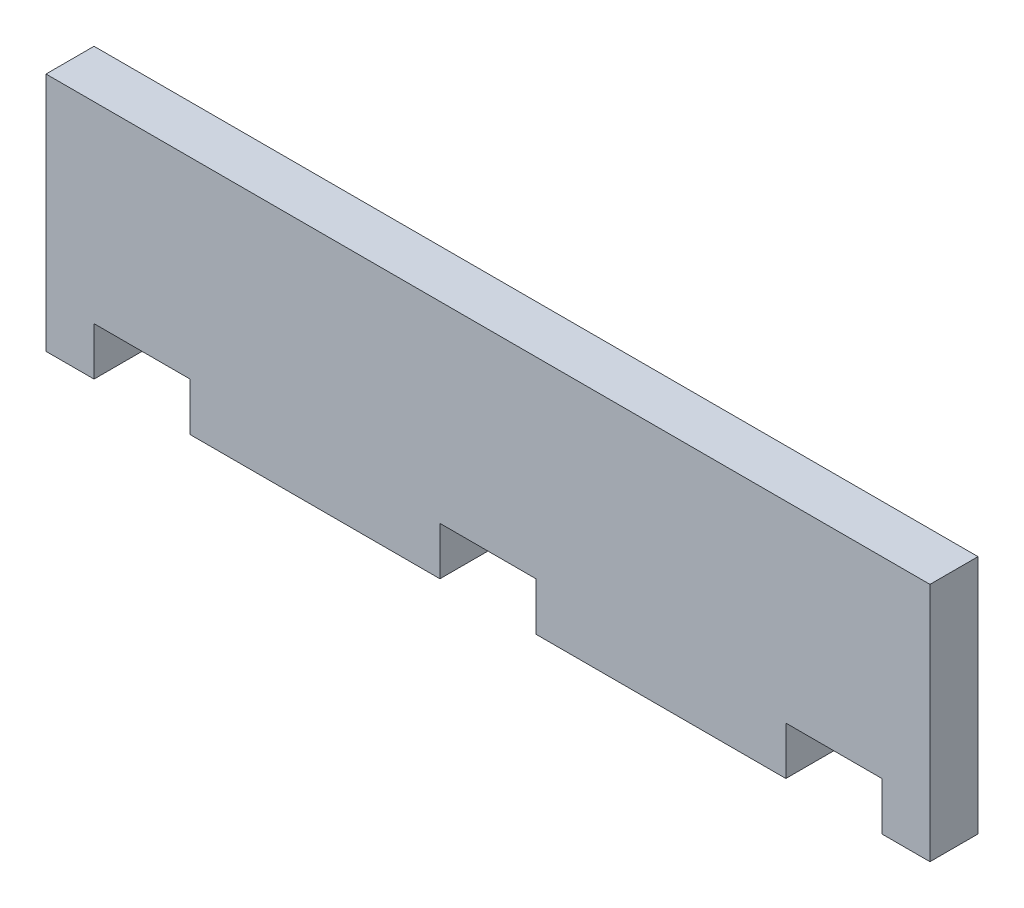
ISO-10303-21;
HEADER;
FILE_DESCRIPTION(('STEP AP214'),'2;1');
FILE_NAME('part.step','',(''),(''),'','','');
FILE_SCHEMA(('AUTOMOTIVE_DESIGN { 1 0 10303 214 1 1 1 1 }'));
ENDSEC;
DATA;
#1=APPLICATION_CONTEXT('core data for automotive mechanical design processes');
#2=APPLICATION_PROTOCOL_DEFINITION('international standard','automotive_design',2000,#1);
#3=PRODUCT_CONTEXT('',#1,'mechanical');
#4=PRODUCT('Part','Part','',(#3));
#5=PRODUCT_RELATED_PRODUCT_CATEGORY('part','',(#4));
#6=PRODUCT_DEFINITION_FORMATION('','',#4);
#7=PRODUCT_DEFINITION_CONTEXT('part definition',#1,'design');
#8=PRODUCT_DEFINITION('design','',#6,#7);
#9=PRODUCT_DEFINITION_SHAPE('','',#8);
#10=(LENGTH_UNIT() NAMED_UNIT(*) SI_UNIT(.MILLI.,.METRE.));
#11=(NAMED_UNIT(*) PLANE_ANGLE_UNIT() SI_UNIT($,.RADIAN.));
#12=(NAMED_UNIT(*) SI_UNIT($,.STERADIAN.) SOLID_ANGLE_UNIT());
#13=UNCERTAINTY_MEASURE_WITH_UNIT(LENGTH_MEASURE(1.E-05),#10,'distance_accuracy_value','');
#14=(GEOMETRIC_REPRESENTATION_CONTEXT(3) GLOBAL_UNCERTAINTY_ASSIGNED_CONTEXT((#13)) GLOBAL_UNIT_ASSIGNED_CONTEXT((#10,
#11,#12)) REPRESENTATION_CONTEXT('',''));
#15=CARTESIAN_POINT('',(0.,0.,0.));
#16=DIRECTION('',(0.,0.,1.));
#17=DIRECTION('',(1.,0.,0.));
#18=AXIS2_PLACEMENT_3D('',#15,#16,#17);
#19=CARTESIAN_POINT('',(0.,0.,6.35));
#20=DIRECTION('',(0.,1.,0.));
#21=DIRECTION('',(0.,0.,1.));
#22=AXIS2_PLACEMENT_3D('',#19,#20,#21);
#23=PLANE('',#22);
#24=DIRECTION('',(1.,0.,0.));
#25=VECTOR('',#24,1.);
#26=CARTESIAN_POINT('',(0.,0.,0.));
#27=LINE('',#26,#25);
#28=CARTESIAN_POINT('',(0.,0.,0.));
#29=VERTEX_POINT('',#28);
#30=CARTESIAN_POINT('',(6.35,0.,0.));
#31=VERTEX_POINT('',#30);
#32=EDGE_CURVE('E168',#29,#31,#27,.T.);
#33=ORIENTED_EDGE('',*,*,#32,.T.);
#34=DIRECTION('',(0.,0.,1.));
#35=VECTOR('',#34,1.);
#36=CARTESIAN_POINT('',(6.35,0.,0.));
#37=LINE('',#36,#35);
#38=CARTESIAN_POINT('',(6.35,0.,6.35));
#39=VERTEX_POINT('',#38);
#40=EDGE_CURVE('E153',#31,#39,#37,.T.);
#41=ORIENTED_EDGE('',*,*,#40,.T.);
#42=DIRECTION('',(1.,0.,0.));
#43=VECTOR('',#42,1.);
#44=CARTESIAN_POINT('',(0.,0.,6.35));
#45=LINE('',#44,#43);
#46=CARTESIAN_POINT('',(0.,0.,6.35));
#47=VERTEX_POINT('',#46);
#48=EDGE_CURVE('E212',#47,#39,#45,.T.);
#49=ORIENTED_EDGE('',*,*,#48,.F.);
#50=DIRECTION('',(0.,0.,-1.));
#51=VECTOR('',#50,1.);
#52=CARTESIAN_POINT('',(0.,0.,6.35));
#53=LINE('',#52,#51);
#54=EDGE_CURVE('E11',#47,#29,#53,.T.);
#55=ORIENTED_EDGE('',*,*,#54,.T.);
#56=EDGE_LOOP('',(#33,#41,#49,#55));
#57=FACE_BOUND('',#56,.T.);
#58=ADVANCED_FACE('F39',(#57),#23,.F.);
#59=CARTESIAN_POINT('',(64.77,0.,0.));
#60=VERTEX_POINT('',#59);
#61=CARTESIAN_POINT('',(97.79,0.,0.));
#62=VERTEX_POINT('',#61);
#63=EDGE_CURVE('E186',#60,#62,#27,.T.);
#64=ORIENTED_EDGE('',*,*,#63,.T.);
#65=DIRECTION('',(0.,0.,1.));
#66=VECTOR('',#65,1.);
#67=CARTESIAN_POINT('',(97.79,0.,0.));
#68=LINE('',#67,#66);
#69=CARTESIAN_POINT('',(97.79,0.,6.35));
#70=VERTEX_POINT('',#69);
#71=EDGE_CURVE('E268',#62,#70,#68,.T.);
#72=ORIENTED_EDGE('',*,*,#71,.T.);
#73=CARTESIAN_POINT('',(64.77,0.,6.35));
#74=VERTEX_POINT('',#73);
#75=EDGE_CURVE('E319',#74,#70,#45,.T.);
#76=ORIENTED_EDGE('',*,*,#75,.F.);
#77=DIRECTION('',(0.,0.,1.));
#78=VECTOR('',#77,1.);
#79=CARTESIAN_POINT('',(64.77,0.,0.));
#80=LINE('',#79,#78);
#81=EDGE_CURVE('E225',#60,#74,#80,.T.);
#82=ORIENTED_EDGE('',*,*,#81,.F.);
#83=EDGE_LOOP('',(#64,#72,#76,#82));
#84=FACE_BOUND('',#83,.T.);
#85=ADVANCED_FACE('F352',(#84),#23,.F.);
#86=CARTESIAN_POINT('',(19.05,0.,6.35));
#87=VERTEX_POINT('',#86);
#88=CARTESIAN_POINT('',(52.07,0.,6.35));
#89=VERTEX_POINT('',#88);
#90=EDGE_CURVE('E215',#87,#89,#45,.T.);
#91=ORIENTED_EDGE('',*,*,#90,.F.);
#92=DIRECTION('',(0.,0.,1.));
#93=VECTOR('',#92,1.);
#94=CARTESIAN_POINT('',(19.05,0.,0.));
#95=LINE('',#94,#93);
#96=CARTESIAN_POINT('',(19.05,0.,0.));
#97=VERTEX_POINT('',#96);
#98=EDGE_CURVE('E163',#97,#87,#95,.T.);
#99=ORIENTED_EDGE('',*,*,#98,.F.);
#100=CARTESIAN_POINT('',(52.07,0.,0.));
#101=VERTEX_POINT('',#100);
#102=EDGE_CURVE('E178',#97,#101,#27,.T.);
#103=ORIENTED_EDGE('',*,*,#102,.T.);
#104=DIRECTION('',(0.,0.,1.));
#105=VECTOR('',#104,1.);
#106=CARTESIAN_POINT('',(52.07,0.,0.));
#107=LINE('',#106,#105);
#108=EDGE_CURVE('E221',#101,#89,#107,.T.);
#109=ORIENTED_EDGE('',*,*,#108,.T.);
#110=EDGE_LOOP('',(#91,#99,#103,#109));
#111=FACE_BOUND('',#110,.T.);
#112=ADVANCED_FACE('F314',(#111),#23,.F.);
#113=CARTESIAN_POINT('',(0.,0.,6.35));
#114=DIRECTION('',(1.,0.,0.));
#115=DIRECTION('',(0.,0.,-1.));
#116=AXIS2_PLACEMENT_3D('',#113,#114,#115);
#117=PLANE('',#116);
#118=DIRECTION('',(0.,-1.,0.));
#119=VECTOR('',#118,1.);
#120=CARTESIAN_POINT('',(0.,0.,0.));
#121=LINE('',#120,#119);
#122=CARTESIAN_POINT('',(0.,31.75,0.));
#123=VERTEX_POINT('',#122);
#124=EDGE_CURVE('E189',#123,#29,#121,.T.);
#125=ORIENTED_EDGE('',*,*,#124,.T.);
#126=ORIENTED_EDGE('',*,*,#54,.F.);
#127=DIRECTION('',(0.,-1.,0.));
#128=VECTOR('',#127,1.);
#129=CARTESIAN_POINT('',(0.,0.,6.35));
#130=LINE('',#129,#128);
#131=CARTESIAN_POINT('',(0.,31.75,6.35));
#132=VERTEX_POINT('',#131);
#133=EDGE_CURVE('E217',#132,#47,#130,.T.);
#134=ORIENTED_EDGE('',*,*,#133,.F.);
#135=DIRECTION('',(0.,0.,-1.));
#136=VECTOR('',#135,1.);
#137=CARTESIAN_POINT('',(0.,31.75,6.35));
#138=LINE('',#137,#136);
#139=EDGE_CURVE('E208',#132,#123,#138,.T.);
#140=ORIENTED_EDGE('',*,*,#139,.T.);
#141=EDGE_LOOP('',(#125,#126,#134,#140));
#142=FACE_BOUND('',#141,.T.);
#143=ADVANCED_FACE('F41',(#142),#117,.F.);
#144=CARTESIAN_POINT('',(110.49,0.,6.35));
#145=VERTEX_POINT('',#144);
#146=CARTESIAN_POINT('',(116.84,0.,6.35));
#147=VERTEX_POINT('',#146);
#148=EDGE_CURVE('E216',#145,#147,#45,.T.);
#149=ORIENTED_EDGE('',*,*,#148,.F.);
#150=DIRECTION('',(0.,0.,1.));
#151=VECTOR('',#150,1.);
#152=CARTESIAN_POINT('',(110.49,0.,0.));
#153=LINE('',#152,#151);
#154=CARTESIAN_POINT('',(110.49,0.,0.));
#155=VERTEX_POINT('',#154);
#156=EDGE_CURVE('E258',#155,#145,#153,.T.);
#157=ORIENTED_EDGE('',*,*,#156,.F.);
#158=CARTESIAN_POINT('',(116.84,0.,0.));
#159=VERTEX_POINT('',#158);
#160=EDGE_CURVE('E180',#155,#159,#27,.T.);
#161=ORIENTED_EDGE('',*,*,#160,.T.);
#162=DIRECTION('',(0.,0.,-1.));
#163=VECTOR('',#162,1.);
#164=CARTESIAN_POINT('',(116.84,0.,6.35));
#165=LINE('',#164,#163);
#166=EDGE_CURVE('E48',#147,#159,#165,.T.);
#167=ORIENTED_EDGE('',*,*,#166,.F.);
#168=EDGE_LOOP('',(#149,#157,#161,#167));
#169=FACE_BOUND('',#168,.T.);
#170=ADVANCED_FACE('F332',(#169),#23,.F.);
#171=CARTESIAN_POINT('',(116.84,0.,6.35));
#172=DIRECTION('',(-1.,0.,0.));
#173=DIRECTION('',(0.,0.,1.));
#174=AXIS2_PLACEMENT_3D('',#171,#172,#173);
#175=PLANE('',#174);
#176=DIRECTION('',(0.,1.,0.));
#177=VECTOR('',#176,1.);
#178=CARTESIAN_POINT('',(116.84,0.,0.));
#179=LINE('',#178,#177);
#180=CARTESIAN_POINT('',(116.84,31.75,0.));
#181=VERTEX_POINT('',#180);
#182=EDGE_CURVE('E177',#159,#181,#179,.T.);
#183=ORIENTED_EDGE('',*,*,#182,.T.);
#184=DIRECTION('',(0.,0.,-1.));
#185=VECTOR('',#184,1.);
#186=CARTESIAN_POINT('',(116.84,31.75,6.35));
#187=LINE('',#186,#185);
#188=CARTESIAN_POINT('',(116.84,31.75,6.35));
#189=VERTEX_POINT('',#188);
#190=EDGE_CURVE('E336',#189,#181,#187,.T.);
#191=ORIENTED_EDGE('',*,*,#190,.F.);
#192=DIRECTION('',(0.,1.,0.));
#193=VECTOR('',#192,1.);
#194=CARTESIAN_POINT('',(116.84,0.,6.35));
#195=LINE('',#194,#193);
#196=EDGE_CURVE('E209',#147,#189,#195,.T.);
#197=ORIENTED_EDGE('',*,*,#196,.F.);
#198=ORIENTED_EDGE('',*,*,#166,.T.);
#199=EDGE_LOOP('',(#183,#191,#197,#198));
#200=FACE_BOUND('',#199,.T.);
#201=ADVANCED_FACE('F337',(#200),#175,.F.);
#202=CARTESIAN_POINT('',(0.,31.75,6.35));
#203=DIRECTION('',(0.,-1.,0.));
#204=DIRECTION('',(0.,0.,-1.));
#205=AXIS2_PLACEMENT_3D('',#202,#203,#204);
#206=PLANE('',#205);
#207=DIRECTION('',(-1.,0.,0.));
#208=VECTOR('',#207,1.);
#209=CARTESIAN_POINT('',(0.,31.75,0.));
#210=LINE('',#209,#208);
#211=EDGE_CURVE('E183',#181,#123,#210,.T.);
#212=ORIENTED_EDGE('',*,*,#211,.T.);
#213=ORIENTED_EDGE('',*,*,#139,.F.);
#214=DIRECTION('',(-1.,0.,0.));
#215=VECTOR('',#214,1.);
#216=CARTESIAN_POINT('',(0.,31.75,6.35));
#217=LINE('',#216,#215);
#218=EDGE_CURVE('E205',#189,#132,#217,.T.);
#219=ORIENTED_EDGE('',*,*,#218,.F.);
#220=ORIENTED_EDGE('',*,*,#190,.T.);
#221=EDGE_LOOP('',(#212,#213,#219,#220));
#222=FACE_BOUND('',#221,.T.);
#223=ADVANCED_FACE('F345',(#222),#206,.F.);
#224=CARTESIAN_POINT('',(0.,0.,6.35));
#225=DIRECTION('',(0.,0.,-1.));
#226=DIRECTION('',(-1.,0.,0.));
#227=AXIS2_PLACEMENT_3D('',#224,#225,#226);
#228=PLANE('',#227);
#229=ORIENTED_EDGE('',*,*,#48,.T.);
#230=DIRECTION('',(0.,-1.,0.));
#231=VECTOR('',#230,1.);
#232=CARTESIAN_POINT('',(6.35,0.,6.35));
#233=LINE('',#232,#231);
#234=CARTESIAN_POINT('',(6.35,6.35,6.35));
#235=VERTEX_POINT('',#234);
#236=EDGE_CURVE('E158',#235,#39,#233,.T.);
#237=ORIENTED_EDGE('',*,*,#236,.F.);
#238=DIRECTION('',(-1.,0.,0.));
#239=VECTOR('',#238,1.);
#240=CARTESIAN_POINT('',(6.35,6.35,6.35));
#241=LINE('',#240,#239);
#242=CARTESIAN_POINT('',(19.05,6.35,6.35));
#243=VERTEX_POINT('',#242);
#244=EDGE_CURVE('E172',#243,#235,#241,.T.);
#245=ORIENTED_EDGE('',*,*,#244,.F.);
#246=DIRECTION('',(0.,1.,0.));
#247=VECTOR('',#246,1.);
#248=CARTESIAN_POINT('',(19.05,0.,6.35));
#249=LINE('',#248,#247);
#250=EDGE_CURVE('E298',#87,#243,#249,.T.);
#251=ORIENTED_EDGE('',*,*,#250,.F.);
#252=ORIENTED_EDGE('',*,*,#90,.T.);
#253=DIRECTION('',(0.,-1.,0.));
#254=VECTOR('',#253,1.);
#255=CARTESIAN_POINT('',(52.07,0.,6.35));
#256=LINE('',#255,#254);
#257=CARTESIAN_POINT('',(52.07,6.35,6.35));
#258=VERTEX_POINT('',#257);
#259=EDGE_CURVE('E245',#258,#89,#256,.T.);
#260=ORIENTED_EDGE('',*,*,#259,.F.);
#261=DIRECTION('',(-1.,0.,0.));
#262=VECTOR('',#261,1.);
#263=CARTESIAN_POINT('',(52.07,6.35,6.35));
#264=LINE('',#263,#262);
#265=CARTESIAN_POINT('',(64.77,6.35,6.35));
#266=VERTEX_POINT('',#265);
#267=EDGE_CURVE('E236',#266,#258,#264,.T.);
#268=ORIENTED_EDGE('',*,*,#267,.F.);
#269=DIRECTION('',(0.,1.,0.));
#270=VECTOR('',#269,1.);
#271=CARTESIAN_POINT('',(64.77,0.,6.35));
#272=LINE('',#271,#270);
#273=EDGE_CURVE('E241',#74,#266,#272,.T.);
#274=ORIENTED_EDGE('',*,*,#273,.F.);
#275=ORIENTED_EDGE('',*,*,#75,.T.);
#276=DIRECTION('',(0.,-1.,0.));
#277=VECTOR('',#276,1.);
#278=CARTESIAN_POINT('',(97.79,0.,6.35));
#279=LINE('',#278,#277);
#280=CARTESIAN_POINT('',(97.79,6.35,6.35));
#281=VERTEX_POINT('',#280);
#282=EDGE_CURVE('E272',#281,#70,#279,.T.);
#283=ORIENTED_EDGE('',*,*,#282,.F.);
#284=DIRECTION('',(-1.,0.,0.));
#285=VECTOR('',#284,1.);
#286=CARTESIAN_POINT('',(110.49,6.35,6.35));
#287=LINE('',#286,#285);
#288=CARTESIAN_POINT('',(110.49,6.35,6.35));
#289=VERTEX_POINT('',#288);
#290=EDGE_CURVE('E276',#289,#281,#287,.T.);
#291=ORIENTED_EDGE('',*,*,#290,.F.);
#292=DIRECTION('',(0.,1.,0.));
#293=VECTOR('',#292,1.);
#294=CARTESIAN_POINT('',(110.49,0.,6.35));
#295=LINE('',#294,#293);
#296=EDGE_CURVE('E235',#145,#289,#295,.T.);
#297=ORIENTED_EDGE('',*,*,#296,.F.);
#298=ORIENTED_EDGE('',*,*,#148,.T.);
#299=ORIENTED_EDGE('',*,*,#196,.T.);
#300=ORIENTED_EDGE('',*,*,#218,.T.);
#301=ORIENTED_EDGE('',*,*,#133,.T.);
#302=EDGE_LOOP('',(#229,#237,#245,#251,#252,#260,#268,#274,#275,#283,#291,#297,#298,#299,#300,#301));
#303=FACE_BOUND('',#302,.T.);
#304=ADVANCED_FACE('F328',(#303),#228,.F.);
#305=CARTESIAN_POINT('',(0.,0.,0.));
#306=DIRECTION('',(0.,0.,-1.));
#307=DIRECTION('',(-1.,0.,0.));
#308=AXIS2_PLACEMENT_3D('',#305,#306,#307);
#309=PLANE('',#308);
#310=DIRECTION('',(0.,-1.,0.));
#311=VECTOR('',#310,1.);
#312=CARTESIAN_POINT('',(6.35,0.,0.));
#313=LINE('',#312,#311);
#314=CARTESIAN_POINT('',(6.35,6.35,0.));
#315=VERTEX_POINT('',#314);
#316=EDGE_CURVE('E156',#315,#31,#313,.T.);
#317=ORIENTED_EDGE('',*,*,#316,.T.);
#318=ORIENTED_EDGE('',*,*,#32,.F.);
#319=ORIENTED_EDGE('',*,*,#124,.F.);
#320=ORIENTED_EDGE('',*,*,#211,.F.);
#321=ORIENTED_EDGE('',*,*,#182,.F.);
#322=ORIENTED_EDGE('',*,*,#160,.F.);
#323=DIRECTION('',(0.,1.,0.));
#324=VECTOR('',#323,1.);
#325=CARTESIAN_POINT('',(110.49,0.,0.));
#326=LINE('',#325,#324);
#327=CARTESIAN_POINT('',(110.49,6.35,0.));
#328=VERTEX_POINT('',#327);
#329=EDGE_CURVE('E275',#155,#328,#326,.T.);
#330=ORIENTED_EDGE('',*,*,#329,.T.);
#331=DIRECTION('',(-1.,0.,0.));
#332=VECTOR('',#331,1.);
#333=CARTESIAN_POINT('',(110.49,6.35,0.));
#334=LINE('',#333,#332);
#335=CARTESIAN_POINT('',(97.79,6.35,0.));
#336=VERTEX_POINT('',#335);
#337=EDGE_CURVE('E63',#328,#336,#334,.T.);
#338=ORIENTED_EDGE('',*,*,#337,.T.);
#339=DIRECTION('',(0.,-1.,0.));
#340=VECTOR('',#339,1.);
#341=CARTESIAN_POINT('',(97.79,0.,0.));
#342=LINE('',#341,#340);
#343=EDGE_CURVE('E262',#336,#62,#342,.T.);
#344=ORIENTED_EDGE('',*,*,#343,.T.);
#345=ORIENTED_EDGE('',*,*,#63,.F.);
#346=DIRECTION('',(0.,1.,0.));
#347=VECTOR('',#346,1.);
#348=CARTESIAN_POINT('',(64.77,0.,0.));
#349=LINE('',#348,#347);
#350=CARTESIAN_POINT('',(64.77,6.35,0.));
#351=VERTEX_POINT('',#350);
#352=EDGE_CURVE('E251',#60,#351,#349,.T.);
#353=ORIENTED_EDGE('',*,*,#352,.T.);
#354=DIRECTION('',(-1.,0.,0.));
#355=VECTOR('',#354,1.);
#356=CARTESIAN_POINT('',(52.07,6.35,0.));
#357=LINE('',#356,#355);
#358=CARTESIAN_POINT('',(52.07,6.35,0.));
#359=VERTEX_POINT('',#358);
#360=EDGE_CURVE('E226',#351,#359,#357,.T.);
#361=ORIENTED_EDGE('',*,*,#360,.T.);
#362=DIRECTION('',(0.,-1.,0.));
#363=VECTOR('',#362,1.);
#364=CARTESIAN_POINT('',(52.07,0.,0.));
#365=LINE('',#364,#363);
#366=EDGE_CURVE('E240',#359,#101,#365,.T.);
#367=ORIENTED_EDGE('',*,*,#366,.T.);
#368=ORIENTED_EDGE('',*,*,#102,.F.);
#369=DIRECTION('',(0.,1.,0.));
#370=VECTOR('',#369,1.);
#371=CARTESIAN_POINT('',(19.05,0.,0.));
#372=LINE('',#371,#370);
#373=CARTESIAN_POINT('',(19.05,6.35,0.));
#374=VERTEX_POINT('',#373);
#375=EDGE_CURVE('E171',#97,#374,#372,.T.);
#376=ORIENTED_EDGE('',*,*,#375,.T.);
#377=DIRECTION('',(-1.,0.,0.));
#378=VECTOR('',#377,1.);
#379=CARTESIAN_POINT('',(6.35,6.35,0.));
#380=LINE('',#379,#378);
#381=EDGE_CURVE('E55',#374,#315,#380,.T.);
#382=ORIENTED_EDGE('',*,*,#381,.T.);
#383=EDGE_LOOP('',(#317,#318,#319,#320,#321,#322,#330,#338,#344,#345,#353,#361,#367,#368,#376,#382));
#384=FACE_BOUND('',#383,.T.);
#385=ADVANCED_FACE('F166',(#384),#309,.T.);
#386=CARTESIAN_POINT('',(52.07,0.,0.));
#387=DIRECTION('',(-1.,0.,0.));
#388=DIRECTION('',(0.,0.,1.));
#389=AXIS2_PLACEMENT_3D('',#386,#387,#388);
#390=PLANE('',#389);
#391=ORIENTED_EDGE('',*,*,#259,.T.);
#392=ORIENTED_EDGE('',*,*,#108,.F.);
#393=ORIENTED_EDGE('',*,*,#366,.F.);
#394=DIRECTION('',(0.,0.,1.));
#395=VECTOR('',#394,1.);
#396=CARTESIAN_POINT('',(52.07,6.35,0.));
#397=LINE('',#396,#395);
#398=EDGE_CURVE('E232',#359,#258,#397,.T.);
#399=ORIENTED_EDGE('',*,*,#398,.T.);
#400=EDGE_LOOP('',(#391,#392,#393,#399));
#401=FACE_BOUND('',#400,.T.);
#402=ADVANCED_FACE('F365',(#401),#390,.F.);
#403=CARTESIAN_POINT('',(52.07,6.35,0.));
#404=DIRECTION('',(0.,1.,0.));
#405=DIRECTION('',(0.,0.,1.));
#406=AXIS2_PLACEMENT_3D('',#403,#404,#405);
#407=PLANE('',#406);
#408=ORIENTED_EDGE('',*,*,#267,.T.);
#409=ORIENTED_EDGE('',*,*,#398,.F.);
#410=ORIENTED_EDGE('',*,*,#360,.F.);
#411=DIRECTION('',(0.,0.,1.));
#412=VECTOR('',#411,1.);
#413=CARTESIAN_POINT('',(64.77,6.35,0.));
#414=LINE('',#413,#412);
#415=EDGE_CURVE('E229',#351,#266,#414,.T.);
#416=ORIENTED_EDGE('',*,*,#415,.T.);
#417=EDGE_LOOP('',(#408,#409,#410,#416));
#418=FACE_BOUND('',#417,.T.);
#419=ADVANCED_FACE('F370',(#418),#407,.F.);
#420=CARTESIAN_POINT('',(64.77,0.,0.));
#421=DIRECTION('',(1.,0.,0.));
#422=DIRECTION('',(0.,0.,-1.));
#423=AXIS2_PLACEMENT_3D('',#420,#421,#422);
#424=PLANE('',#423);
#425=ORIENTED_EDGE('',*,*,#273,.T.);
#426=ORIENTED_EDGE('',*,*,#415,.F.);
#427=ORIENTED_EDGE('',*,*,#352,.F.);
#428=ORIENTED_EDGE('',*,*,#81,.T.);
#429=EDGE_LOOP('',(#425,#426,#427,#428));
#430=FACE_BOUND('',#429,.T.);
#431=ADVANCED_FACE('F372',(#430),#424,.F.);
#432=CARTESIAN_POINT('',(97.79,0.,0.));
#433=DIRECTION('',(-1.,0.,0.));
#434=DIRECTION('',(0.,0.,1.));
#435=AXIS2_PLACEMENT_3D('',#432,#433,#434);
#436=PLANE('',#435);
#437=ORIENTED_EDGE('',*,*,#282,.T.);
#438=ORIENTED_EDGE('',*,*,#71,.F.);
#439=ORIENTED_EDGE('',*,*,#343,.F.);
#440=DIRECTION('',(0.,0.,1.));
#441=VECTOR('',#440,1.);
#442=CARTESIAN_POINT('',(97.79,6.35,0.));
#443=LINE('',#442,#441);
#444=EDGE_CURVE('E265',#336,#281,#443,.T.);
#445=ORIENTED_EDGE('',*,*,#444,.T.);
#446=EDGE_LOOP('',(#437,#438,#439,#445));
#447=FACE_BOUND('',#446,.T.);
#448=ADVANCED_FACE('F375',(#447),#436,.F.);
#449=CARTESIAN_POINT('',(110.49,6.35,0.));
#450=DIRECTION('',(0.,1.,0.));
#451=DIRECTION('',(0.,0.,1.));
#452=AXIS2_PLACEMENT_3D('',#449,#450,#451);
#453=PLANE('',#452);
#454=ORIENTED_EDGE('',*,*,#290,.T.);
#455=ORIENTED_EDGE('',*,*,#444,.F.);
#456=ORIENTED_EDGE('',*,*,#337,.F.);
#457=DIRECTION('',(0.,0.,1.));
#458=VECTOR('',#457,1.);
#459=CARTESIAN_POINT('',(110.49,6.35,0.));
#460=LINE('',#459,#458);
#461=EDGE_CURVE('E261',#328,#289,#460,.T.);
#462=ORIENTED_EDGE('',*,*,#461,.T.);
#463=EDGE_LOOP('',(#454,#455,#456,#462));
#464=FACE_BOUND('',#463,.T.);
#465=ADVANCED_FACE('F383',(#464),#453,.F.);
#466=CARTESIAN_POINT('',(110.49,0.,0.));
#467=DIRECTION('',(1.,0.,0.));
#468=DIRECTION('',(0.,0.,-1.));
#469=AXIS2_PLACEMENT_3D('',#466,#467,#468);
#470=PLANE('',#469);
#471=ORIENTED_EDGE('',*,*,#296,.T.);
#472=ORIENTED_EDGE('',*,*,#461,.F.);
#473=ORIENTED_EDGE('',*,*,#329,.F.);
#474=ORIENTED_EDGE('',*,*,#156,.T.);
#475=EDGE_LOOP('',(#471,#472,#473,#474));
#476=FACE_BOUND('',#475,.T.);
#477=ADVANCED_FACE('F380',(#476),#470,.F.);
#478=CARTESIAN_POINT('',(6.35,0.,0.));
#479=DIRECTION('',(-1.,0.,0.));
#480=DIRECTION('',(0.,-1.,0.));
#481=AXIS2_PLACEMENT_3D('',#478,#479,#480);
#482=PLANE('',#481);
#483=ORIENTED_EDGE('',*,*,#236,.T.);
#484=ORIENTED_EDGE('',*,*,#40,.F.);
#485=ORIENTED_EDGE('',*,*,#316,.F.);
#486=DIRECTION('',(0.,0.,1.));
#487=VECTOR('',#486,1.);
#488=CARTESIAN_POINT('',(6.35,6.35,0.));
#489=LINE('',#488,#487);
#490=EDGE_CURVE('E198',#315,#235,#489,.T.);
#491=ORIENTED_EDGE('',*,*,#490,.T.);
#492=EDGE_LOOP('',(#483,#484,#485,#491));
#493=FACE_BOUND('',#492,.T.);
#494=ADVANCED_FACE('F155',(#493),#482,.F.);
#495=CARTESIAN_POINT('',(6.35,6.35,0.));
#496=DIRECTION('',(0.,1.,0.));
#497=DIRECTION('',(0.,0.,1.));
#498=AXIS2_PLACEMENT_3D('',#495,#496,#497);
#499=PLANE('',#498);
#500=ORIENTED_EDGE('',*,*,#244,.T.);
#501=ORIENTED_EDGE('',*,*,#490,.F.);
#502=ORIENTED_EDGE('',*,*,#381,.F.);
#503=DIRECTION('',(0.,0.,1.));
#504=VECTOR('',#503,1.);
#505=CARTESIAN_POINT('',(19.05,6.35,0.));
#506=LINE('',#505,#504);
#507=EDGE_CURVE('E202',#374,#243,#506,.T.);
#508=ORIENTED_EDGE('',*,*,#507,.T.);
#509=EDGE_LOOP('',(#500,#501,#502,#508));
#510=FACE_BOUND('',#509,.T.);
#511=ADVANCED_FACE('F392',(#510),#499,.F.);
#512=CARTESIAN_POINT('',(19.05,0.,0.));
#513=DIRECTION('',(1.,0.,0.));
#514=DIRECTION('',(0.,0.,-1.));
#515=AXIS2_PLACEMENT_3D('',#512,#513,#514);
#516=PLANE('',#515);
#517=ORIENTED_EDGE('',*,*,#250,.T.);
#518=ORIENTED_EDGE('',*,*,#507,.F.);
#519=ORIENTED_EDGE('',*,*,#375,.F.);
#520=ORIENTED_EDGE('',*,*,#98,.T.);
#521=EDGE_LOOP('',(#517,#518,#519,#520));
#522=FACE_BOUND('',#521,.T.);
#523=ADVANCED_FACE('F310',(#522),#516,.F.);
#524=CLOSED_SHELL('',(#58,#85,#112,#143,#170,#201,#223,#304,#385,#402,#419,#431,#448,#465,#477,
#494,#511,#523));
#525=MANIFOLD_SOLID_BREP('B2',#524);
#526=ADVANCED_BREP_SHAPE_REPRESENTATION('',(#18,#525),#14);
#527=SHAPE_DEFINITION_REPRESENTATION(#9,#526);
ENDSEC;
END-ISO-10303-21;
